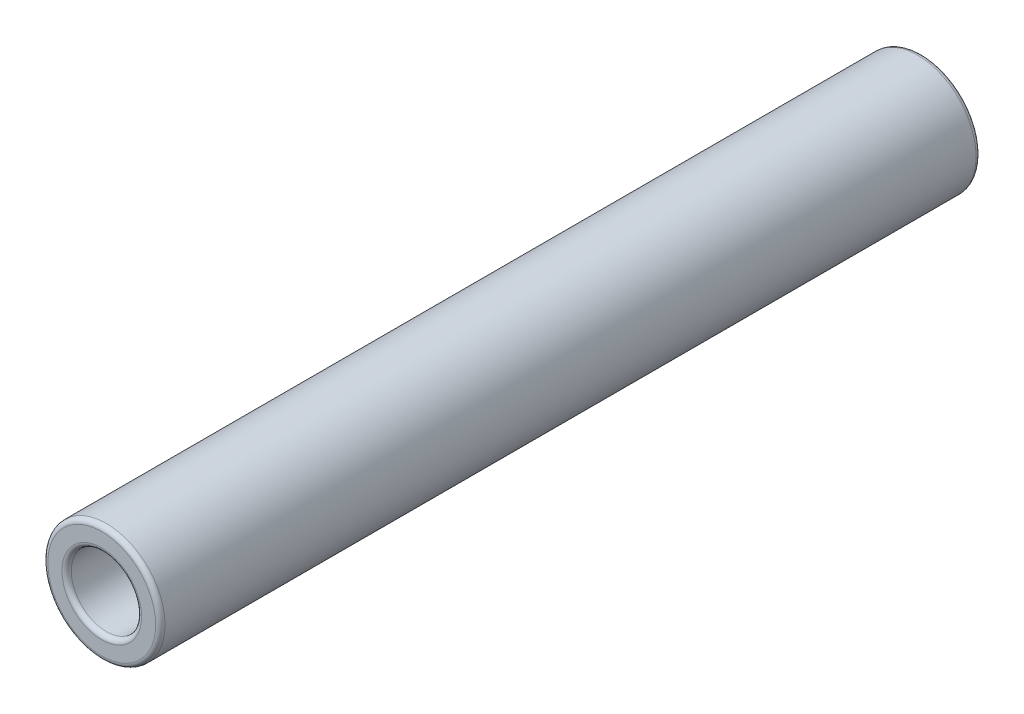
ISO-10303-21;
HEADER;
FILE_DESCRIPTION(('STEP AP214'),'2;1');
FILE_NAME('part.step','',(''),(''),'','','');
FILE_SCHEMA(('AUTOMOTIVE_DESIGN { 1 0 10303 214 1 1 1 1 }'));
ENDSEC;
DATA;
#1=APPLICATION_CONTEXT('core data for automotive mechanical design processes');
#2=APPLICATION_PROTOCOL_DEFINITION('international standard','automotive_design',2000,#1);
#3=PRODUCT_CONTEXT('',#1,'mechanical');
#4=PRODUCT('Part','Part','',(#3));
#5=PRODUCT_RELATED_PRODUCT_CATEGORY('part','',(#4));
#6=PRODUCT_DEFINITION_FORMATION('','',#4);
#7=PRODUCT_DEFINITION_CONTEXT('part definition',#1,'design');
#8=PRODUCT_DEFINITION('design','',#6,#7);
#9=PRODUCT_DEFINITION_SHAPE('','',#8);
#10=(LENGTH_UNIT() NAMED_UNIT(*) SI_UNIT(.MILLI.,.METRE.));
#11=(NAMED_UNIT(*) PLANE_ANGLE_UNIT() SI_UNIT($,.RADIAN.));
#12=(NAMED_UNIT(*) SI_UNIT($,.STERADIAN.) SOLID_ANGLE_UNIT());
#13=UNCERTAINTY_MEASURE_WITH_UNIT(LENGTH_MEASURE(1.E-05),#10,'distance_accuracy_value','');
#14=(GEOMETRIC_REPRESENTATION_CONTEXT(3) GLOBAL_UNCERTAINTY_ASSIGNED_CONTEXT((#13)) GLOBAL_UNIT_ASSIGNED_CONTEXT((#10,
#11,#12)) REPRESENTATION_CONTEXT('',''));
#15=CARTESIAN_POINT('',(0.,0.,0.));
#16=DIRECTION('',(0.,0.,1.));
#17=DIRECTION('',(1.,0.,0.));
#18=AXIS2_PLACEMENT_3D('',#15,#16,#17);
#19=CARTESIAN_POINT('',(0.,0.,-17.3));
#20=DIRECTION('',(0.,0.,1.));
#21=DIRECTION('',(1.,0.,0.));
#22=AXIS2_PLACEMENT_3D('',#19,#20,#21);
#23=TOROIDAL_SURFACE('',#22,1.7,0.199999999999999);
#24=CARTESIAN_POINT('',(0.,0.,-17.3));
#25=DIRECTION('',(0.,0.,1.));
#26=DIRECTION('',(1.,0.,0.));
#27=AXIS2_PLACEMENT_3D('',#24,#25,#26);
#28=CIRCLE('',#27,1.5);
#29=CARTESIAN_POINT('',(1.5,0.,-17.3));
#30=VERTEX_POINT('',#29);
#31=EDGE_CURVE('E10',#30,#30,#28,.T.);
#32=ORIENTED_EDGE('',*,*,#31,.T.);
#33=EDGE_LOOP('',(#32));
#34=FACE_BOUND('',#33,.T.);
#35=CARTESIAN_POINT('',(0.,0.,-17.5));
#36=DIRECTION('',(0.,0.,1.));
#37=DIRECTION('',(1.,0.,0.));
#38=AXIS2_PLACEMENT_3D('',#35,#36,#37);
#39=CIRCLE('',#38,1.7);
#40=CARTESIAN_POINT('',(1.7,0.,-17.5));
#41=VERTEX_POINT('',#40);
#42=EDGE_CURVE('E63',#41,#41,#39,.T.);
#43=ORIENTED_EDGE('',*,*,#42,.F.);
#44=EDGE_LOOP('',(#43));
#45=FACE_BOUND('',#44,.T.);
#46=ADVANCED_FACE('F35',(#34,#45),#23,.T.);
#47=CARTESIAN_POINT('',(0.,0.,-17.5025310079661));
#48=DIRECTION('',(0.,0.,1.));
#49=DIRECTION('',(1.,0.,0.));
#50=AXIS2_PLACEMENT_3D('',#47,#48,#49);
#51=CYLINDRICAL_SURFACE('',#50,1.5);
#52=CARTESIAN_POINT('',(0.,0.,17.3));
#53=DIRECTION('',(0.,0.,1.));
#54=DIRECTION('',(1.,0.,0.));
#55=AXIS2_PLACEMENT_3D('',#52,#53,#54);
#56=CIRCLE('',#55,1.5);
#57=CARTESIAN_POINT('',(1.5,0.,17.3));
#58=VERTEX_POINT('',#57);
#59=EDGE_CURVE('E41',#58,#58,#56,.T.);
#60=ORIENTED_EDGE('',*,*,#59,.T.);
#61=EDGE_LOOP('',(#60));
#62=FACE_BOUND('',#61,.T.);
#63=ORIENTED_EDGE('',*,*,#31,.F.);
#64=EDGE_LOOP('',(#63));
#65=FACE_BOUND('',#64,.T.);
#66=ADVANCED_FACE('F71',(#62,#65),#51,.F.);
#67=CARTESIAN_POINT('',(0.,0.,17.3));
#68=DIRECTION('',(0.,0.,1.));
#69=DIRECTION('',(1.,0.,0.));
#70=AXIS2_PLACEMENT_3D('',#67,#68,#69);
#71=TOROIDAL_SURFACE('',#70,1.7,0.199999999999999);
#72=CARTESIAN_POINT('',(0.,0.,17.5));
#73=DIRECTION('',(0.,0.,1.));
#74=DIRECTION('',(1.,0.,0.));
#75=AXIS2_PLACEMENT_3D('',#72,#73,#74);
#76=CIRCLE('',#75,1.7);
#77=CARTESIAN_POINT('',(1.7,0.,17.5));
#78=VERTEX_POINT('',#77);
#79=EDGE_CURVE('E45',#78,#78,#76,.T.);
#80=ORIENTED_EDGE('',*,*,#79,.T.);
#81=EDGE_LOOP('',(#80));
#82=FACE_BOUND('',#81,.T.);
#83=ORIENTED_EDGE('',*,*,#59,.F.);
#84=EDGE_LOOP('',(#83));
#85=FACE_BOUND('',#84,.T.);
#86=ADVANCED_FACE('F75',(#82,#85),#71,.T.);
#87=CARTESIAN_POINT('',(1.7,0.,17.5));
#88=DIRECTION('',(0.,0.,1.));
#89=DIRECTION('',(1.,0.,0.));
#90=AXIS2_PLACEMENT_3D('',#87,#88,#89);
#91=PLANE('',#90);
#92=CARTESIAN_POINT('',(0.,0.,17.5));
#93=DIRECTION('',(0.,0.,1.));
#94=DIRECTION('',(1.,0.,0.));
#95=AXIS2_PLACEMENT_3D('',#92,#93,#94);
#96=CIRCLE('',#95,2.3);
#97=CARTESIAN_POINT('',(2.3,0.,17.5));
#98=VERTEX_POINT('',#97);
#99=EDGE_CURVE('E49',#98,#98,#96,.T.);
#100=ORIENTED_EDGE('',*,*,#99,.T.);
#101=EDGE_LOOP('',(#100));
#102=FACE_BOUND('',#101,.T.);
#103=ORIENTED_EDGE('',*,*,#79,.F.);
#104=EDGE_LOOP('',(#103));
#105=FACE_BOUND('',#104,.T.);
#106=ADVANCED_FACE('F79',(#102,#105),#91,.T.);
#107=CARTESIAN_POINT('',(0.,0.,17.3));
#108=DIRECTION('',(0.,0.,1.));
#109=DIRECTION('',(1.,0.,0.));
#110=AXIS2_PLACEMENT_3D('',#107,#108,#109);
#111=TOROIDAL_SURFACE('',#110,2.3,0.199999999999997);
#112=CARTESIAN_POINT('',(0.,0.,17.3));
#113=DIRECTION('',(0.,0.,1.));
#114=DIRECTION('',(1.,0.,0.));
#115=AXIS2_PLACEMENT_3D('',#112,#113,#114);
#116=CIRCLE('',#115,2.5);
#117=CARTESIAN_POINT('',(2.5,0.,17.3));
#118=VERTEX_POINT('',#117);
#119=EDGE_CURVE('E54',#118,#118,#116,.T.);
#120=ORIENTED_EDGE('',*,*,#119,.T.);
#121=EDGE_LOOP('',(#120));
#122=FACE_BOUND('',#121,.T.);
#123=ORIENTED_EDGE('',*,*,#99,.F.);
#124=EDGE_LOOP('',(#123));
#125=FACE_BOUND('',#124,.T.);
#126=ADVANCED_FACE('F86',(#122,#125),#111,.T.);
#127=CARTESIAN_POINT('',(0.,0.,-17.5025310079661));
#128=DIRECTION('',(0.,0.,1.));
#129=DIRECTION('',(1.,0.,0.));
#130=AXIS2_PLACEMENT_3D('',#127,#128,#129);
#131=CYLINDRICAL_SURFACE('',#130,2.5);
#132=CARTESIAN_POINT('',(0.,0.,-17.3));
#133=DIRECTION('',(0.,0.,1.));
#134=DIRECTION('',(1.,0.,0.));
#135=AXIS2_PLACEMENT_3D('',#132,#133,#134);
#136=CIRCLE('',#135,2.5);
#137=CARTESIAN_POINT('',(2.5,0.,-17.3));
#138=VERTEX_POINT('',#137);
#139=EDGE_CURVE('E57',#138,#138,#136,.T.);
#140=ORIENTED_EDGE('',*,*,#139,.T.);
#141=EDGE_LOOP('',(#140));
#142=FACE_BOUND('',#141,.T.);
#143=ORIENTED_EDGE('',*,*,#119,.F.);
#144=EDGE_LOOP('',(#143));
#145=FACE_BOUND('',#144,.T.);
#146=ADVANCED_FACE('F90',(#142,#145),#131,.T.);
#147=CARTESIAN_POINT('',(0.,0.,-17.3));
#148=DIRECTION('',(0.,0.,1.));
#149=DIRECTION('',(1.,0.,0.));
#150=AXIS2_PLACEMENT_3D('',#147,#148,#149);
#151=TOROIDAL_SURFACE('',#150,2.3,0.199999999999999);
#152=CARTESIAN_POINT('',(0.,0.,-17.5));
#153=DIRECTION('',(0.,0.,1.));
#154=DIRECTION('',(1.,0.,0.));
#155=AXIS2_PLACEMENT_3D('',#152,#153,#154);
#156=CIRCLE('',#155,2.3);
#157=CARTESIAN_POINT('',(2.3,0.,-17.5));
#158=VERTEX_POINT('',#157);
#159=EDGE_CURVE('E60',#158,#158,#156,.T.);
#160=ORIENTED_EDGE('',*,*,#159,.T.);
#161=EDGE_LOOP('',(#160));
#162=FACE_BOUND('',#161,.T.);
#163=ORIENTED_EDGE('',*,*,#139,.F.);
#164=EDGE_LOOP('',(#163));
#165=FACE_BOUND('',#164,.T.);
#166=ADVANCED_FACE('F94',(#162,#165),#151,.T.);
#167=CARTESIAN_POINT('',(2.3,0.,-17.5));
#168=DIRECTION('',(0.,0.,-1.));
#169=DIRECTION('',(-1.,0.,0.));
#170=AXIS2_PLACEMENT_3D('',#167,#168,#169);
#171=PLANE('',#170);
#172=ORIENTED_EDGE('',*,*,#42,.T.);
#173=EDGE_LOOP('',(#172));
#174=FACE_BOUND('',#173,.T.);
#175=ORIENTED_EDGE('',*,*,#159,.F.);
#176=EDGE_LOOP('',(#175));
#177=FACE_BOUND('',#176,.T.);
#178=ADVANCED_FACE('F67',(#174,#177),#171,.T.);
#179=CLOSED_SHELL('',(#46,#66,#86,#106,#126,#146,#166,#178));
#180=MANIFOLD_SOLID_BREP('B2',#179);
#181=ADVANCED_BREP_SHAPE_REPRESENTATION('',(#18,#180),#14);
#182=SHAPE_DEFINITION_REPRESENTATION(#9,#181);
ENDSEC;
END-ISO-10303-21;
